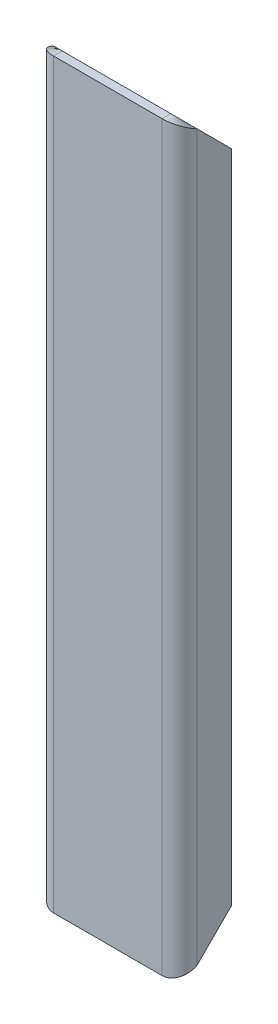
ISO-10303-21;
HEADER;
FILE_DESCRIPTION(('STEP AP214'),'2;1');
FILE_NAME('part.step','',(''),(''),'','','');
FILE_SCHEMA(('AUTOMOTIVE_DESIGN { 1 0 10303 214 1 1 1 1 }'));
ENDSEC;
DATA;
#1=APPLICATION_CONTEXT('core data for automotive mechanical design processes');
#2=APPLICATION_PROTOCOL_DEFINITION('international standard','automotive_design',2000,#1);
#3=PRODUCT_CONTEXT('',#1,'mechanical');
#4=PRODUCT('Part','Part','',(#3));
#5=PRODUCT_RELATED_PRODUCT_CATEGORY('part','',(#4));
#6=PRODUCT_DEFINITION_FORMATION('','',#4);
#7=PRODUCT_DEFINITION_CONTEXT('part definition',#1,'design');
#8=PRODUCT_DEFINITION('design','',#6,#7);
#9=PRODUCT_DEFINITION_SHAPE('','',#8);
#10=(LENGTH_UNIT() NAMED_UNIT(*) SI_UNIT(.MILLI.,.METRE.));
#11=(NAMED_UNIT(*) PLANE_ANGLE_UNIT() SI_UNIT($,.RADIAN.));
#12=(NAMED_UNIT(*) SI_UNIT($,.STERADIAN.) SOLID_ANGLE_UNIT());
#13=UNCERTAINTY_MEASURE_WITH_UNIT(LENGTH_MEASURE(1.E-05),#10,'distance_accuracy_value','');
#14=(GEOMETRIC_REPRESENTATION_CONTEXT(3) GLOBAL_UNCERTAINTY_ASSIGNED_CONTEXT((#13)) GLOBAL_UNIT_ASSIGNED_CONTEXT((#10,
#11,#12)) REPRESENTATION_CONTEXT('',''));
#15=CARTESIAN_POINT('',(0.,0.,0.));
#16=DIRECTION('',(0.,0.,1.));
#17=DIRECTION('',(1.,0.,0.));
#18=AXIS2_PLACEMENT_3D('',#15,#16,#17);
#19=CARTESIAN_POINT('',(16.5,175.,0.));
#20=DIRECTION('',(-1.,0.,0.));
#21=DIRECTION('',(0.,0.,1.));
#22=AXIS2_PLACEMENT_3D('',#19,#20,#21);
#23=PLANE('',#22);
#24=DIRECTION('',(0.,-0.707106781186544,-0.707106781186552));
#25=VECTOR('',#24,1.);
#26=CARTESIAN_POINT('',(16.5,175.,1.99999999999999));
#27=LINE('',#26,#25);
#28=CARTESIAN_POINT('',(16.5,171.,-2.00000000000001));
#29=VERTEX_POINT('',#28);
#30=CARTESIAN_POINT('',(16.5,163.,-10.));
#31=VERTEX_POINT('',#30);
#32=EDGE_CURVE('E245',#29,#31,#27,.T.);
#33=ORIENTED_EDGE('',*,*,#32,.F.);
#34=DIRECTION('',(0.,-1.,0.));
#35=VECTOR('',#34,1.);
#36=CARTESIAN_POINT('',(16.5,175.,-2.00000000000001));
#37=LINE('',#36,#35);
#38=CARTESIAN_POINT('',(16.5,3.99999999999998,-2.00000000000001));
#39=VERTEX_POINT('',#38);
#40=EDGE_CURVE('E60',#29,#39,#37,.T.);
#41=ORIENTED_EDGE('',*,*,#40,.T.);
#42=DIRECTION('',(0.,0.707106781186543,-0.707106781186552));
#43=VECTOR('',#42,1.);
#44=CARTESIAN_POINT('',(16.5,88.499999999999,-86.5));
#45=LINE('',#44,#43);
#46=CARTESIAN_POINT('',(16.5,11.9999999999999,-10.));
#47=VERTEX_POINT('',#46);
#48=EDGE_CURVE('E197',#39,#47,#45,.T.);
#49=ORIENTED_EDGE('',*,*,#48,.T.);
#50=DIRECTION('',(0.,-1.,0.));
#51=VECTOR('',#50,1.);
#52=CARTESIAN_POINT('',(16.5,175.,-10.));
#53=LINE('',#52,#51);
#54=EDGE_CURVE('E11',#31,#47,#53,.T.);
#55=ORIENTED_EDGE('',*,*,#54,.F.);
#56=EDGE_LOOP('',(#33,#41,#49,#55));
#57=FACE_BOUND('',#56,.T.);
#58=ADVANCED_FACE('F38',(#57),#23,.F.);
#59=CARTESIAN_POINT('',(14.5,175.,-10.));
#60=DIRECTION('',(0.,0.,-1.));
#61=DIRECTION('',(-1.,0.,0.));
#62=AXIS2_PLACEMENT_3D('',#59,#60,#61);
#63=PLANE('',#62);
#64=DIRECTION('',(0.,-1.,0.));
#65=VECTOR('',#64,1.);
#66=CARTESIAN_POINT('',(14.5,175.,-10.));
#67=LINE('',#66,#65);
#68=CARTESIAN_POINT('',(14.5,163.,-10.));
#69=VERTEX_POINT('',#68);
#70=CARTESIAN_POINT('',(14.5,11.9999999999999,-10.));
#71=VERTEX_POINT('',#70);
#72=EDGE_CURVE('E45',#69,#71,#67,.T.);
#73=ORIENTED_EDGE('',*,*,#72,.F.);
#74=DIRECTION('',(1.,0.,0.));
#75=VECTOR('',#74,1.);
#76=CARTESIAN_POINT('',(16.5,163.,-10.));
#77=LINE('',#76,#75);
#78=EDGE_CURVE('E248',#31,#69,#77,.F.);
#79=ORIENTED_EDGE('',*,*,#78,.F.);
#80=ORIENTED_EDGE('',*,*,#54,.T.);
#81=DIRECTION('',(-1.,0.,0.));
#82=VECTOR('',#81,1.);
#83=CARTESIAN_POINT('',(14.5,11.9999999999999,-10.));
#84=LINE('',#83,#82);
#85=EDGE_CURVE('E195',#71,#47,#84,.F.);
#86=ORIENTED_EDGE('',*,*,#85,.F.);
#87=EDGE_LOOP('',(#73,#79,#80,#86));
#88=FACE_BOUND('',#87,.T.);
#89=ADVANCED_FACE('F200',(#88),#63,.T.);
#90=CARTESIAN_POINT('',(14.5,175.,0.));
#91=DIRECTION('',(-1.,0.,0.));
#92=DIRECTION('',(0.,0.,1.));
#93=AXIS2_PLACEMENT_3D('',#90,#91,#92);
#94=PLANE('',#93);
#95=DIRECTION('',(0.,-1.,0.));
#96=VECTOR('',#95,1.);
#97=CARTESIAN_POINT('',(14.5,175.,-2.00000000000001));
#98=LINE('',#97,#96);
#99=CARTESIAN_POINT('',(14.5,171.,-2.00000000000001));
#100=VERTEX_POINT('',#99);
#101=CARTESIAN_POINT('',(14.5,3.99999999999998,-2.00000000000001));
#102=VERTEX_POINT('',#101);
#103=EDGE_CURVE('E177',#100,#102,#98,.T.);
#104=ORIENTED_EDGE('',*,*,#103,.F.);
#105=DIRECTION('',(0.,-0.707106781186544,-0.707106781186552));
#106=VECTOR('',#105,1.);
#107=CARTESIAN_POINT('',(14.5,175.,1.99999999999999));
#108=LINE('',#107,#106);
#109=EDGE_CURVE('E186',#100,#69,#108,.T.);
#110=ORIENTED_EDGE('',*,*,#109,.T.);
#111=ORIENTED_EDGE('',*,*,#72,.T.);
#112=DIRECTION('',(0.,0.707106781186543,-0.707106781186552));
#113=VECTOR('',#112,1.);
#114=CARTESIAN_POINT('',(14.5,88.499999999999,-86.5));
#115=LINE('',#114,#113);
#116=EDGE_CURVE('E185',#102,#71,#115,.T.);
#117=ORIENTED_EDGE('',*,*,#116,.F.);
#118=EDGE_LOOP('',(#104,#110,#111,#117));
#119=FACE_BOUND('',#118,.T.);
#120=ADVANCED_FACE('F184',(#119),#94,.T.);
#121=CARTESIAN_POINT('',(12.5,175.,-2.00000000000001));
#122=DIRECTION('',(0.,-1.,0.));
#123=DIRECTION('',(0.,0.,-1.));
#124=AXIS2_PLACEMENT_3D('',#121,#122,#123);
#125=CYLINDRICAL_SURFACE('',#124,2.);
#126=DIRECTION('',(0.,-1.,0.));
#127=VECTOR('',#126,1.);
#128=CARTESIAN_POINT('',(12.5,175.,0.));
#129=LINE('',#128,#127);
#130=CARTESIAN_POINT('',(12.5,173.,0.));
#131=VERTEX_POINT('',#130);
#132=CARTESIAN_POINT('',(12.5,1.99999999999998,0.));
#133=VERTEX_POINT('',#132);
#134=EDGE_CURVE('E175',#131,#133,#129,.T.);
#135=ORIENTED_EDGE('',*,*,#134,.F.);
#136=CARTESIAN_POINT('',(12.5,171.,-2.00000000000001));
#137=DIRECTION('',(0.,-0.707106781186552,0.707106781186543));
#138=DIRECTION('',(0.,-0.707106781186543,-0.707106781186552));
#139=AXIS2_PLACEMENT_3D('',#136,#137,#138);
#140=ELLIPSE('',#139,2.82842712474617,2.);
#141=EDGE_CURVE('E156',#100,#131,#140,.T.);
#142=ORIENTED_EDGE('',*,*,#141,.F.);
#143=ORIENTED_EDGE('',*,*,#103,.T.);
#144=CARTESIAN_POINT('',(12.5,3.99999999999998,-2.00000000000001));
#145=DIRECTION('',(0.,0.707106781186552,0.707106781186543));
#146=DIRECTION('',(0.,-0.707106781186543,0.707106781186552));
#147=AXIS2_PLACEMENT_3D('',#144,#145,#146);
#148=ELLIPSE('',#147,2.82842712474617,2.);
#149=EDGE_CURVE('E224',#133,#102,#148,.T.);
#150=ORIENTED_EDGE('',*,*,#149,.F.);
#151=EDGE_LOOP('',(#135,#142,#143,#150));
#152=FACE_BOUND('',#151,.T.);
#153=ADVANCED_FACE('F291',(#152),#125,.F.);
#154=CARTESIAN_POINT('',(-14.5,175.,0.));
#155=DIRECTION('',(0.,0.,-1.));
#156=DIRECTION('',(-1.,0.,0.));
#157=AXIS2_PLACEMENT_3D('',#154,#155,#156);
#158=PLANE('',#157);
#159=DIRECTION('',(0.,-1.,0.));
#160=VECTOR('',#159,1.);
#161=CARTESIAN_POINT('',(-12.5,175.,0.));
#162=LINE('',#161,#160);
#163=CARTESIAN_POINT('',(-12.5,173.,0.));
#164=VERTEX_POINT('',#163);
#165=CARTESIAN_POINT('',(-12.5,1.99999999999997,0.));
#166=VERTEX_POINT('',#165);
#167=EDGE_CURVE('E173',#164,#166,#162,.T.);
#168=ORIENTED_EDGE('',*,*,#167,.F.);
#169=DIRECTION('',(-1.,0.,0.));
#170=VECTOR('',#169,1.);
#171=CARTESIAN_POINT('',(-14.5,173.,0.));
#172=LINE('',#171,#170);
#173=EDGE_CURVE('E288',#131,#164,#172,.T.);
#174=ORIENTED_EDGE('',*,*,#173,.F.);
#175=ORIENTED_EDGE('',*,*,#134,.T.);
#176=DIRECTION('',(1.,0.,0.));
#177=VECTOR('',#176,1.);
#178=CARTESIAN_POINT('',(-14.5,1.99999999999997,0.));
#179=LINE('',#178,#177);
#180=EDGE_CURVE('E234',#166,#133,#179,.T.);
#181=ORIENTED_EDGE('',*,*,#180,.F.);
#182=EDGE_LOOP('',(#168,#174,#175,#181));
#183=FACE_BOUND('',#182,.T.);
#184=ADVANCED_FACE('F284',(#183),#158,.T.);
#185=CARTESIAN_POINT('',(-12.5,175.,-2.));
#186=DIRECTION('',(0.,-1.,0.));
#187=DIRECTION('',(0.,0.,-1.));
#188=AXIS2_PLACEMENT_3D('',#185,#186,#187);
#189=CYLINDRICAL_SURFACE('',#188,2.);
#190=DIRECTION('',(0.,-1.,0.));
#191=VECTOR('',#190,1.);
#192=CARTESIAN_POINT('',(-14.5,175.,-2.));
#193=LINE('',#192,#191);
#194=CARTESIAN_POINT('',(-14.5,171.,-2.));
#195=VERTEX_POINT('',#194);
#196=CARTESIAN_POINT('',(-14.5,3.99999999999996,-2.));
#197=VERTEX_POINT('',#196);
#198=EDGE_CURVE('E171',#195,#197,#193,.T.);
#199=ORIENTED_EDGE('',*,*,#198,.F.);
#200=CARTESIAN_POINT('',(-12.5,171.,-2.));
#201=DIRECTION('',(0.,-0.707106781186552,0.707106781186543));
#202=DIRECTION('',(0.,-0.707106781186543,-0.707106781186552));
#203=AXIS2_PLACEMENT_3D('',#200,#201,#202);
#204=ELLIPSE('',#203,2.82842712474617,2.);
#205=EDGE_CURVE('E134',#164,#195,#204,.T.);
#206=ORIENTED_EDGE('',*,*,#205,.F.);
#207=ORIENTED_EDGE('',*,*,#167,.T.);
#208=CARTESIAN_POINT('',(-12.5,3.99999999999995,-2.));
#209=DIRECTION('',(0.,0.707106781186552,0.707106781186543));
#210=DIRECTION('',(0.,-0.707106781186543,0.707106781186552));
#211=AXIS2_PLACEMENT_3D('',#208,#209,#210);
#212=ELLIPSE('',#211,2.82842712474617,2.);
#213=EDGE_CURVE('E223',#197,#166,#212,.T.);
#214=ORIENTED_EDGE('',*,*,#213,.F.);
#215=EDGE_LOOP('',(#199,#206,#207,#214));
#216=FACE_BOUND('',#215,.T.);
#217=ADVANCED_FACE('F279',(#216),#189,.F.);
#218=CARTESIAN_POINT('',(-14.5,175.,0.));
#219=DIRECTION('',(1.,0.,0.));
#220=DIRECTION('',(0.,0.,-1.));
#221=AXIS2_PLACEMENT_3D('',#218,#219,#220);
#222=PLANE('',#221);
#223=DIRECTION('',(0.,-1.,0.));
#224=VECTOR('',#223,1.);
#225=CARTESIAN_POINT('',(-14.5,175.,-20.));
#226=LINE('',#225,#224);
#227=CARTESIAN_POINT('',(-14.5,153.,-20.));
#228=VERTEX_POINT('',#227);
#229=CARTESIAN_POINT('',(-14.5,21.9999999999997,-20.));
#230=VERTEX_POINT('',#229);
#231=EDGE_CURVE('E164',#228,#230,#226,.T.);
#232=ORIENTED_EDGE('',*,*,#231,.F.);
#233=DIRECTION('',(0.,-0.707106781186544,-0.707106781186552));
#234=VECTOR('',#233,1.);
#235=CARTESIAN_POINT('',(-14.5,175.,1.99999999999999));
#236=LINE('',#235,#234);
#237=EDGE_CURVE('E138',#195,#228,#236,.T.);
#238=ORIENTED_EDGE('',*,*,#237,.F.);
#239=ORIENTED_EDGE('',*,*,#198,.T.);
#240=DIRECTION('',(0.,-0.707106781186543,0.707106781186552));
#241=VECTOR('',#240,1.);
#242=CARTESIAN_POINT('',(-14.5,88.499999999999,-86.5));
#243=LINE('',#242,#241);
#244=EDGE_CURVE('E259',#230,#197,#243,.T.);
#245=ORIENTED_EDGE('',*,*,#244,.F.);
#246=EDGE_LOOP('',(#232,#238,#239,#245));
#247=FACE_BOUND('',#246,.T.);
#248=ADVANCED_FACE('F275',(#247),#222,.T.);
#249=CARTESIAN_POINT('',(-16.5,175.,-20.));
#250=DIRECTION('',(0.,0.,-1.));
#251=DIRECTION('',(-1.,0.,0.));
#252=AXIS2_PLACEMENT_3D('',#249,#250,#251);
#253=PLANE('',#252);
#254=DIRECTION('',(0.,-1.,0.));
#255=VECTOR('',#254,1.);
#256=CARTESIAN_POINT('',(-16.5,175.,-20.));
#257=LINE('',#256,#255);
#258=CARTESIAN_POINT('',(-16.5,153.,-20.));
#259=VERTEX_POINT('',#258);
#260=CARTESIAN_POINT('',(-16.5,21.9999999999997,-20.));
#261=VERTEX_POINT('',#260);
#262=EDGE_CURVE('E162',#259,#261,#257,.T.);
#263=ORIENTED_EDGE('',*,*,#262,.F.);
#264=DIRECTION('',(-1.,0.,0.));
#265=VECTOR('',#264,1.);
#266=CARTESIAN_POINT('',(-16.5,153.,-20.));
#267=LINE('',#266,#265);
#268=EDGE_CURVE('E137',#259,#228,#267,.F.);
#269=ORIENTED_EDGE('',*,*,#268,.T.);
#270=ORIENTED_EDGE('',*,*,#231,.T.);
#271=DIRECTION('',(1.,0.,0.));
#272=VECTOR('',#271,1.);
#273=CARTESIAN_POINT('',(-14.5,21.9999999999997,-20.));
#274=LINE('',#273,#272);
#275=EDGE_CURVE('E243',#230,#261,#274,.F.);
#276=ORIENTED_EDGE('',*,*,#275,.T.);
#277=EDGE_LOOP('',(#263,#269,#270,#276));
#278=FACE_BOUND('',#277,.T.);
#279=ADVANCED_FACE('F270',(#278),#253,.T.);
#280=CARTESIAN_POINT('',(-16.5,175.,0.));
#281=DIRECTION('',(1.,0.,0.));
#282=DIRECTION('',(0.,0.,-1.));
#283=AXIS2_PLACEMENT_3D('',#280,#281,#282);
#284=PLANE('',#283);
#285=DIRECTION('',(0.,-0.707106781186544,-0.707106781186552));
#286=VECTOR('',#285,1.);
#287=CARTESIAN_POINT('',(-16.5,175.,1.99999999999999));
#288=LINE('',#287,#286);
#289=CARTESIAN_POINT('',(-16.5,171.,-2.));
#290=VERTEX_POINT('',#289);
#291=EDGE_CURVE('E141',#290,#259,#288,.T.);
#292=ORIENTED_EDGE('',*,*,#291,.T.);
#293=ORIENTED_EDGE('',*,*,#262,.T.);
#294=DIRECTION('',(0.,-0.707106781186543,0.707106781186552));
#295=VECTOR('',#294,1.);
#296=CARTESIAN_POINT('',(-16.5,88.499999999999,-86.5));
#297=LINE('',#296,#295);
#298=CARTESIAN_POINT('',(-16.5,3.99999999999995,-2.));
#299=VERTEX_POINT('',#298);
#300=EDGE_CURVE('E161',#261,#299,#297,.T.);
#301=ORIENTED_EDGE('',*,*,#300,.T.);
#302=DIRECTION('',(0.,-1.,0.));
#303=VECTOR('',#302,1.);
#304=CARTESIAN_POINT('',(-16.5,175.,-2.));
#305=LINE('',#304,#303);
#306=EDGE_CURVE('E153',#290,#299,#305,.T.);
#307=ORIENTED_EDGE('',*,*,#306,.F.);
#308=EDGE_LOOP('',(#292,#293,#301,#307));
#309=FACE_BOUND('',#308,.T.);
#310=ADVANCED_FACE('F159',(#309),#284,.F.);
#311=CARTESIAN_POINT('',(-12.5,175.,-2.));
#312=DIRECTION('',(0.,-1.,0.));
#313=DIRECTION('',(0.,0.,-1.));
#314=AXIS2_PLACEMENT_3D('',#311,#312,#313);
#315=CYLINDRICAL_SURFACE('',#314,4.);
#316=CARTESIAN_POINT('',(-12.5,171.,-2.));
#317=DIRECTION('',(0.,-0.894427190999918,0.447213595499953));
#318=DIRECTION('',(0.,-0.447213595499953,-0.894427190999918));
#319=AXIS2_PLACEMENT_3D('',#316,#317,#318);
#320=ELLIPSE('',#319,4.47213595499957,4.);
#321=CARTESIAN_POINT('',(-12.5,173.,2.));
#322=VERTEX_POINT('',#321);
#323=EDGE_CURVE('E131',#322,#290,#320,.T.);
#324=ORIENTED_EDGE('',*,*,#323,.T.);
#325=ORIENTED_EDGE('',*,*,#306,.T.);
#326=CARTESIAN_POINT('',(-12.5,3.99999999999995,-2.));
#327=DIRECTION('',(0.,0.894427190999918,0.447213595499954));
#328=DIRECTION('',(0.,-0.447213595499954,0.894427190999918));
#329=AXIS2_PLACEMENT_3D('',#326,#327,#328);
#330=ELLIPSE('',#329,4.47213595499957,4.);
#331=CARTESIAN_POINT('',(-12.5,1.99999999999997,2.));
#332=VERTEX_POINT('',#331);
#333=EDGE_CURVE('E257',#299,#332,#330,.T.);
#334=ORIENTED_EDGE('',*,*,#333,.T.);
#335=DIRECTION('',(0.,-1.,0.));
#336=VECTOR('',#335,1.);
#337=CARTESIAN_POINT('',(-12.5,175.,2.));
#338=LINE('',#337,#336);
#339=EDGE_CURVE('E155',#322,#332,#338,.T.);
#340=ORIENTED_EDGE('',*,*,#339,.F.);
#341=EDGE_LOOP('',(#324,#325,#334,#340));
#342=FACE_BOUND('',#341,.T.);
#343=ADVANCED_FACE('F151',(#342),#315,.T.);
#344=CARTESIAN_POINT('',(-14.5,175.,2.));
#345=DIRECTION('',(0.,0.,-1.));
#346=DIRECTION('',(-1.,0.,0.));
#347=AXIS2_PLACEMENT_3D('',#344,#345,#346);
#348=PLANE('',#347);
#349=DIRECTION('',(-1.,0.,0.));
#350=VECTOR('',#349,1.);
#351=CARTESIAN_POINT('',(-14.5,173.,2.));
#352=LINE('',#351,#350);
#353=CARTESIAN_POINT('',(12.5,173.,1.99999999999999));
#354=VERTEX_POINT('',#353);
#355=EDGE_CURVE('E296',#354,#322,#352,.T.);
#356=ORIENTED_EDGE('',*,*,#355,.T.);
#357=ORIENTED_EDGE('',*,*,#339,.T.);
#358=DIRECTION('',(-1.,0.,0.));
#359=VECTOR('',#358,1.);
#360=CARTESIAN_POINT('',(-14.5,1.99999999999997,2.));
#361=LINE('',#360,#359);
#362=CARTESIAN_POINT('',(12.5,1.99999999999997,1.99999999999999));
#363=VERTEX_POINT('',#362);
#364=EDGE_CURVE('E231',#332,#363,#361,.F.);
#365=ORIENTED_EDGE('',*,*,#364,.T.);
#366=DIRECTION('',(0.,-1.,0.));
#367=VECTOR('',#366,1.);
#368=CARTESIAN_POINT('',(12.5,175.,1.99999999999999));
#369=LINE('',#368,#367);
#370=EDGE_CURVE('E166',#354,#363,#369,.T.);
#371=ORIENTED_EDGE('',*,*,#370,.F.);
#372=EDGE_LOOP('',(#356,#357,#365,#371));
#373=FACE_BOUND('',#372,.T.);
#374=ADVANCED_FACE('F237',(#373),#348,.F.);
#375=CARTESIAN_POINT('',(12.5,175.,-2.00000000000001));
#376=DIRECTION('',(0.,-1.,0.));
#377=DIRECTION('',(0.,0.,-1.));
#378=AXIS2_PLACEMENT_3D('',#375,#376,#377);
#379=CYLINDRICAL_SURFACE('',#378,4.);
#380=CARTESIAN_POINT('',(12.5,171.,-2.00000000000001));
#381=DIRECTION('',(0.,-0.894427190999918,0.447213595499953));
#382=DIRECTION('',(0.,-0.447213595499953,-0.894427190999918));
#383=AXIS2_PLACEMENT_3D('',#380,#381,#382);
#384=ELLIPSE('',#383,4.47213595499957,4.);
#385=EDGE_CURVE('E213',#29,#354,#384,.T.);
#386=ORIENTED_EDGE('',*,*,#385,.T.);
#387=ORIENTED_EDGE('',*,*,#370,.T.);
#388=CARTESIAN_POINT('',(12.5,3.99999999999998,-2.00000000000001));
#389=DIRECTION('',(0.,0.894427190999918,0.447213595499954));
#390=DIRECTION('',(0.,-0.447213595499954,0.894427190999918));
#391=AXIS2_PLACEMENT_3D('',#388,#389,#390);
#392=ELLIPSE('',#391,4.47213595499957,4.);
#393=EDGE_CURVE('E212',#363,#39,#392,.T.);
#394=ORIENTED_EDGE('',*,*,#393,.T.);
#395=ORIENTED_EDGE('',*,*,#40,.F.);
#396=EDGE_LOOP('',(#386,#387,#394,#395));
#397=FACE_BOUND('',#396,.T.);
#398=ADVANCED_FACE('F211',(#397),#379,.T.);
#399=CARTESIAN_POINT('',(14.5,88.499999999999,-86.5));
#400=DIRECTION('',(0.,0.707106781186552,0.707106781186543));
#401=DIRECTION('',(0.,0.707106781186543,-0.707106781186552));
#402=AXIS2_PLACEMENT_3D('',#399,#400,#401);
#403=PLANE('',#402);
#404=ORIENTED_EDGE('',*,*,#116,.T.);
#405=ORIENTED_EDGE('',*,*,#85,.T.);
#406=ORIENTED_EDGE('',*,*,#48,.F.);
#407=DIRECTION('',(-1.,0.,0.));
#408=VECTOR('',#407,1.);
#409=CARTESIAN_POINT('',(14.5,3.99999999999998,-2.00000000000001));
#410=LINE('',#409,#408);
#411=EDGE_CURVE('E196',#102,#39,#410,.F.);
#412=ORIENTED_EDGE('',*,*,#411,.F.);
#413=EDGE_LOOP('',(#404,#405,#406,#412));
#414=FACE_BOUND('',#413,.T.);
#415=ADVANCED_FACE('F193',(#414),#403,.F.);
#416=CARTESIAN_POINT('',(-14.5,1.99999999999997,0.));
#417=DIRECTION('',(0.,1.,0.));
#418=DIRECTION('',(1.,0.,0.));
#419=AXIS2_PLACEMENT_3D('',#416,#417,#418);
#420=PLANE('',#419);
#421=ORIENTED_EDGE('',*,*,#180,.T.);
#422=DIRECTION('',(0.,0.,-1.));
#423=VECTOR('',#422,1.);
#424=CARTESIAN_POINT('',(12.5,1.99999999999998,0.));
#425=LINE('',#424,#423);
#426=EDGE_CURVE('E198',#133,#363,#425,.F.);
#427=ORIENTED_EDGE('',*,*,#426,.T.);
#428=ORIENTED_EDGE('',*,*,#364,.F.);
#429=DIRECTION('',(0.,0.,-1.));
#430=VECTOR('',#429,1.);
#431=CARTESIAN_POINT('',(-12.5,1.99999999999997,0.));
#432=LINE('',#431,#430);
#433=EDGE_CURVE('E235',#166,#332,#432,.F.);
#434=ORIENTED_EDGE('',*,*,#433,.F.);
#435=EDGE_LOOP('',(#421,#427,#428,#434));
#436=FACE_BOUND('',#435,.T.);
#437=ADVANCED_FACE('F229',(#436),#420,.F.);
#438=CARTESIAN_POINT('',(-14.5,88.499999999999,-86.5));
#439=DIRECTION('',(0.,0.707106781186552,0.707106781186543));
#440=DIRECTION('',(0.,-0.707106781186543,0.707106781186552));
#441=AXIS2_PLACEMENT_3D('',#438,#439,#440);
#442=PLANE('',#441);
#443=ORIENTED_EDGE('',*,*,#244,.T.);
#444=DIRECTION('',(1.,0.,0.));
#445=VECTOR('',#444,1.);
#446=CARTESIAN_POINT('',(-14.5,3.99999999999996,-2.));
#447=LINE('',#446,#445);
#448=EDGE_CURVE('E240',#197,#299,#447,.F.);
#449=ORIENTED_EDGE('',*,*,#448,.T.);
#450=ORIENTED_EDGE('',*,*,#300,.F.);
#451=ORIENTED_EDGE('',*,*,#275,.F.);
#452=EDGE_LOOP('',(#443,#449,#450,#451));
#453=FACE_BOUND('',#452,.T.);
#454=ADVANCED_FACE('F273',(#453),#442,.F.);
#455=CARTESIAN_POINT('',(-12.5,1.99999999999997,0.));
#456=CARTESIAN_POINT('',(-12.5,1.99999999999997,0.666666666666666));
#457=CARTESIAN_POINT('',(-12.5,1.99999999999997,1.33333333333333));
#458=CARTESIAN_POINT('',(-12.5,1.99999999999997,2.));
#459=CARTESIAN_POINT('',(-8.5,1.99999999999997,0.));
#460=CARTESIAN_POINT('',(-7.16666666666667,1.99999999999997,0.666666666666667));
#461=CARTESIAN_POINT('',(-5.83333333333334,1.99999999999997,1.33333333333333));
#462=CARTESIAN_POINT('',(-4.5,1.99999999999997,2.));
#463=CARTESIAN_POINT('',(-8.5,5.99999999999993,-4.));
#464=CARTESIAN_POINT('',(-7.16666666666667,5.99999999999993,-4.66666666666667));
#465=CARTESIAN_POINT('',(-5.83333333333334,5.99999999999993,-5.33333333333333));
#466=CARTESIAN_POINT('',(-4.5,5.99999999999993,-6.));
#467=CARTESIAN_POINT('',(-12.5,5.99999999999993,-4.));
#468=CARTESIAN_POINT('',(-12.5,5.99999999999993,-4.66666666666667));
#469=CARTESIAN_POINT('',(-12.5,5.99999999999993,-5.33333333333333));
#470=CARTESIAN_POINT('',(-12.5,5.99999999999993,-6.));
#471=CARTESIAN_POINT('',(-16.5,5.99999999999993,-4.));
#472=CARTESIAN_POINT('',(-17.8333333333333,5.99999999999993,-4.66666666666667));
#473=CARTESIAN_POINT('',(-19.1666666666667,5.99999999999993,-5.33333333333334));
#474=CARTESIAN_POINT('',(-20.5,5.99999999999993,-6.));
#475=CARTESIAN_POINT('',(-16.5,1.99999999999997,0.));
#476=CARTESIAN_POINT('',(-17.8333333333333,1.99999999999997,0.666666666666667));
#477=CARTESIAN_POINT('',(-19.1666666666667,1.99999999999997,1.33333333333333));
#478=CARTESIAN_POINT('',(-20.5,1.99999999999997,2.));
#479=CARTESIAN_POINT('',(-12.5,1.99999999999997,0.));
#480=CARTESIAN_POINT('',(-12.5,1.99999999999997,0.666666666666666));
#481=CARTESIAN_POINT('',(-12.5,1.99999999999997,1.33333333333333));
#482=CARTESIAN_POINT('',(-12.5,1.99999999999997,2.));
#483=(BOUNDED_SURFACE() B_SPLINE_SURFACE(3,3,((#455,#456,#457,#458),(#459,#460,#461,#462),(#463,
#464,#465,#466),(#467,#468,#469,#470),(#471,#472,#473,#474),(#475,#476,#477,#478),(#479,#480,
#481,#482)),.UNSPECIFIED.,.T.,.F.,.F.) B_SPLINE_SURFACE_WITH_KNOTS((4,3,4),(4,4),(0.,0.5,1.),
(0.,1.),.UNSPECIFIED.) GEOMETRIC_REPRESENTATION_ITEM() RATIONAL_B_SPLINE_SURFACE(((1.,1.,1.,1.),
(0.333333333333333,0.333333333333333,0.333333333333333,0.333333333333333),(0.333333333333333,
0.333333333333333,0.333333333333333,0.333333333333333),(1.,1.,1.,1.),(0.333333333333333,
0.333333333333333,0.333333333333333,0.333333333333333),(0.333333333333333,0.333333333333333,
0.333333333333333,0.333333333333333),(1.,1.,1.,1.))) REPRESENTATION_ITEM('') SURFACE());
#484=ORIENTED_EDGE('',*,*,#213,.T.);
#485=ORIENTED_EDGE('',*,*,#433,.T.);
#486=ORIENTED_EDGE('',*,*,#333,.F.);
#487=ORIENTED_EDGE('',*,*,#448,.F.);
#488=EDGE_LOOP('',(#484,#485,#486,#487));
#489=FACE_BOUND('',#488,.T.);
#490=ADVANCED_FACE('F282',(#489),#483,.T.);
#491=CARTESIAN_POINT('',(12.5,2.,0.));
#492=CARTESIAN_POINT('',(12.5,2.,0.666666666666661));
#493=CARTESIAN_POINT('',(12.5,2.,1.33333333333333));
#494=CARTESIAN_POINT('',(12.5,2.,1.99999999999999));
#495=CARTESIAN_POINT('',(16.5,2.,0.));
#496=CARTESIAN_POINT('',(17.8333333333333,2.,0.666666666666662));
#497=CARTESIAN_POINT('',(19.1666666666667,2.,1.33333333333333));
#498=CARTESIAN_POINT('',(20.5,2.,1.99999999999999));
#499=CARTESIAN_POINT('',(16.5,5.99999999999995,-4.));
#500=CARTESIAN_POINT('',(17.8333333333333,5.99999999999995,-4.66666666666667));
#501=CARTESIAN_POINT('',(19.1666666666667,5.99999999999996,-5.33333333333334));
#502=CARTESIAN_POINT('',(20.5,5.99999999999996,-6.));
#503=CARTESIAN_POINT('',(12.5,5.99999999999995,-4.00000000000001));
#504=CARTESIAN_POINT('',(12.5,5.99999999999995,-4.66666666666667));
#505=CARTESIAN_POINT('',(12.5,5.99999999999996,-5.33333333333334));
#506=CARTESIAN_POINT('',(12.5,5.99999999999996,-6.00000000000001));
#507=CARTESIAN_POINT('',(8.5,5.99999999999995,-4.00000000000001));
#508=CARTESIAN_POINT('',(7.16666666666667,5.99999999999996,-4.66666666666667));
#509=CARTESIAN_POINT('',(5.83333333333333,5.99999999999996,-5.33333333333334));
#510=CARTESIAN_POINT('',(4.5,5.99999999999996,-6.00000000000001));
#511=CARTESIAN_POINT('',(8.5,2.,0.));
#512=CARTESIAN_POINT('',(7.16666666666667,2.,0.666666666666662));
#513=CARTESIAN_POINT('',(5.83333333333333,2.,1.33333333333333));
#514=CARTESIAN_POINT('',(4.5,2.,1.99999999999999));
#515=CARTESIAN_POINT('',(12.5,2.,0.));
#516=CARTESIAN_POINT('',(12.5,2.,0.666666666666661));
#517=CARTESIAN_POINT('',(12.5,2.,1.33333333333333));
#518=CARTESIAN_POINT('',(12.5,2.,1.99999999999999));
#519=(BOUNDED_SURFACE() B_SPLINE_SURFACE(3,3,((#491,#492,#493,#494),(#495,#496,#497,#498),(#499,
#500,#501,#502),(#503,#504,#505,#506),(#507,#508,#509,#510),(#511,#512,#513,#514),(#515,#516,
#517,#518)),.UNSPECIFIED.,.T.,.F.,.F.) B_SPLINE_SURFACE_WITH_KNOTS((4,3,4),(4,4),(0.,0.5,1.),
(0.,1.),.UNSPECIFIED.) GEOMETRIC_REPRESENTATION_ITEM() RATIONAL_B_SPLINE_SURFACE(((1.,1.,1.,1.),
(0.333333333333333,0.333333333333333,0.333333333333333,0.333333333333333),(0.333333333333333,
0.333333333333333,0.333333333333333,0.333333333333333),(1.,1.,1.,1.),(0.333333333333333,
0.333333333333333,0.333333333333333,0.333333333333333),(0.333333333333333,0.333333333333333,
0.333333333333333,0.333333333333333),(1.,1.,1.,1.))) REPRESENTATION_ITEM('') SURFACE());
#520=ORIENTED_EDGE('',*,*,#149,.T.);
#521=ORIENTED_EDGE('',*,*,#411,.T.);
#522=ORIENTED_EDGE('',*,*,#393,.F.);
#523=ORIENTED_EDGE('',*,*,#426,.F.);
#524=EDGE_LOOP('',(#520,#521,#522,#523));
#525=FACE_BOUND('',#524,.T.);
#526=ADVANCED_FACE('F221',(#525),#519,.T.);
#527=CARTESIAN_POINT('',(16.5,175.,1.99999999999999));
#528=DIRECTION('',(0.,0.707106781186552,-0.707106781186544));
#529=DIRECTION('',(0.,-0.707106781186544,-0.707106781186552));
#530=AXIS2_PLACEMENT_3D('',#527,#528,#529);
#531=PLANE('',#530);
#532=DIRECTION('',(1.,0.,0.));
#533=VECTOR('',#532,1.);
#534=CARTESIAN_POINT('',(16.5,171.,-2.00000000000001));
#535=LINE('',#534,#533);
#536=EDGE_CURVE('E252',#29,#100,#535,.F.);
#537=ORIENTED_EDGE('',*,*,#536,.F.);
#538=ORIENTED_EDGE('',*,*,#32,.T.);
#539=ORIENTED_EDGE('',*,*,#78,.T.);
#540=ORIENTED_EDGE('',*,*,#109,.F.);
#541=EDGE_LOOP('',(#537,#538,#539,#540));
#542=FACE_BOUND('',#541,.T.);
#543=ADVANCED_FACE('F311',(#542),#531,.T.);
#544=CARTESIAN_POINT('',(-16.5,175.,1.99999999999999));
#545=DIRECTION('',(0.,-0.707106781186552,0.707106781186544));
#546=DIRECTION('',(0.,-0.707106781186544,-0.707106781186552));
#547=AXIS2_PLACEMENT_3D('',#544,#545,#546);
#548=PLANE('',#547);
#549=ORIENTED_EDGE('',*,*,#268,.F.);
#550=ORIENTED_EDGE('',*,*,#291,.F.);
#551=DIRECTION('',(-1.,0.,0.));
#552=VECTOR('',#551,1.);
#553=CARTESIAN_POINT('',(-16.5,171.,-2.));
#554=LINE('',#553,#552);
#555=EDGE_CURVE('E127',#290,#195,#554,.F.);
#556=ORIENTED_EDGE('',*,*,#555,.T.);
#557=ORIENTED_EDGE('',*,*,#237,.T.);
#558=EDGE_LOOP('',(#549,#550,#556,#557));
#559=FACE_BOUND('',#558,.T.);
#560=ADVANCED_FACE('F142',(#559),#548,.F.);
#561=CARTESIAN_POINT('',(-14.5,173.,0.));
#562=DIRECTION('',(0.,-1.,0.));
#563=DIRECTION('',(-1.,0.,0.));
#564=AXIS2_PLACEMENT_3D('',#561,#562,#563);
#565=PLANE('',#564);
#566=ORIENTED_EDGE('',*,*,#173,.T.);
#567=DIRECTION('',(0.,0.,-1.));
#568=VECTOR('',#567,1.);
#569=CARTESIAN_POINT('',(-12.5,173.,0.));
#570=LINE('',#569,#568);
#571=EDGE_CURVE('E147',#164,#322,#570,.F.);
#572=ORIENTED_EDGE('',*,*,#571,.T.);
#573=ORIENTED_EDGE('',*,*,#355,.F.);
#574=DIRECTION('',(0.,0.,-1.));
#575=VECTOR('',#574,1.);
#576=CARTESIAN_POINT('',(12.5,173.,0.));
#577=LINE('',#576,#575);
#578=EDGE_CURVE('E52',#131,#354,#577,.F.);
#579=ORIENTED_EDGE('',*,*,#578,.F.);
#580=EDGE_LOOP('',(#566,#572,#573,#579));
#581=FACE_BOUND('',#580,.T.);
#582=ADVANCED_FACE('F302',(#581),#565,.F.);
#583=CARTESIAN_POINT('',(12.5,169.,-4.00000000000001));
#584=CARTESIAN_POINT('',(12.5,169.,-4.66666666666667));
#585=CARTESIAN_POINT('',(12.5,169.,-5.33333333333334));
#586=CARTESIAN_POINT('',(12.5,169.,-6.00000000000001));
#587=CARTESIAN_POINT('',(16.5,169.,-4.00000000000001));
#588=CARTESIAN_POINT('',(17.8333333333333,169.,-4.66666666666667));
#589=CARTESIAN_POINT('',(19.1666666666667,169.,-5.33333333333334));
#590=CARTESIAN_POINT('',(20.5,169.,-6.00000000000001));
#591=CARTESIAN_POINT('',(16.5,173.,0.));
#592=CARTESIAN_POINT('',(17.8333333333333,173.,0.666666666666661));
#593=CARTESIAN_POINT('',(19.1666666666667,173.,1.33333333333333));
#594=CARTESIAN_POINT('',(20.5,173.,1.99999999999999));
#595=CARTESIAN_POINT('',(12.5,173.,0.));
#596=CARTESIAN_POINT('',(12.5,173.,0.666666666666661));
#597=CARTESIAN_POINT('',(12.5,173.,1.33333333333333));
#598=CARTESIAN_POINT('',(12.5,173.,1.99999999999999));
#599=CARTESIAN_POINT('',(8.5,173.,0.));
#600=CARTESIAN_POINT('',(7.16666666666667,173.,0.666666666666662));
#601=CARTESIAN_POINT('',(5.83333333333333,173.,1.33333333333333));
#602=CARTESIAN_POINT('',(4.5,173.,2.));
#603=CARTESIAN_POINT('',(8.5,169.,-4.00000000000001));
#604=CARTESIAN_POINT('',(7.16666666666667,169.,-4.66666666666667));
#605=CARTESIAN_POINT('',(5.83333333333333,169.,-5.33333333333334));
#606=CARTESIAN_POINT('',(4.5,169.,-6.00000000000001));
#607=CARTESIAN_POINT('',(12.5,169.,-4.00000000000001));
#608=CARTESIAN_POINT('',(12.5,169.,-4.66666666666667));
#609=CARTESIAN_POINT('',(12.5,169.,-5.33333333333334));
#610=CARTESIAN_POINT('',(12.5,169.,-6.00000000000001));
#611=(BOUNDED_SURFACE() B_SPLINE_SURFACE(3,3,((#583,#584,#585,#586),(#587,#588,#589,#590),(#591,
#592,#593,#594),(#595,#596,#597,#598),(#599,#600,#601,#602),(#603,#604,#605,#606),(#607,#608,
#609,#610)),.UNSPECIFIED.,.T.,.F.,.F.) B_SPLINE_SURFACE_WITH_KNOTS((4,3,4),(4,4),(0.,0.5,1.),
(0.,1.),.UNSPECIFIED.) GEOMETRIC_REPRESENTATION_ITEM() RATIONAL_B_SPLINE_SURFACE(((1.,1.,1.,1.),
(0.333333333333333,0.333333333333333,0.333333333333333,0.333333333333333),(0.333333333333333,
0.333333333333333,0.333333333333333,0.333333333333333),(1.,1.,1.,1.),(0.333333333333333,
0.333333333333333,0.333333333333333,0.333333333333333),(0.333333333333333,0.333333333333333,
0.333333333333333,0.333333333333333),(1.,1.,1.,1.))) REPRESENTATION_ITEM('') SURFACE());
#612=ORIENTED_EDGE('',*,*,#141,.T.);
#613=ORIENTED_EDGE('',*,*,#578,.T.);
#614=ORIENTED_EDGE('',*,*,#385,.F.);
#615=ORIENTED_EDGE('',*,*,#536,.T.);
#616=EDGE_LOOP('',(#612,#613,#614,#615));
#617=FACE_BOUND('',#616,.T.);
#618=ADVANCED_FACE('F304',(#617),#611,.T.);
#619=CARTESIAN_POINT('',(-12.5,169.,-4.));
#620=CARTESIAN_POINT('',(-12.5,169.,-4.66666666666667));
#621=CARTESIAN_POINT('',(-12.5,169.,-5.33333333333333));
#622=CARTESIAN_POINT('',(-12.5,169.,-6.));
#623=CARTESIAN_POINT('',(-8.5,169.,-4.));
#624=CARTESIAN_POINT('',(-7.16666666666667,169.,-4.66666666666667));
#625=CARTESIAN_POINT('',(-5.83333333333334,169.,-5.33333333333334));
#626=CARTESIAN_POINT('',(-4.5,169.,-6.));
#627=CARTESIAN_POINT('',(-8.5,173.,0.));
#628=CARTESIAN_POINT('',(-7.16666666666667,173.,0.666666666666666));
#629=CARTESIAN_POINT('',(-5.83333333333334,173.,1.33333333333333));
#630=CARTESIAN_POINT('',(-4.5,173.,2.));
#631=CARTESIAN_POINT('',(-12.5,173.,0.));
#632=CARTESIAN_POINT('',(-12.5,173.,0.666666666666666));
#633=CARTESIAN_POINT('',(-12.5,173.,1.33333333333333));
#634=CARTESIAN_POINT('',(-12.5,173.,2.));
#635=CARTESIAN_POINT('',(-16.5,173.,0.));
#636=CARTESIAN_POINT('',(-17.8333333333333,173.,0.666666666666667));
#637=CARTESIAN_POINT('',(-19.1666666666667,173.,1.33333333333333));
#638=CARTESIAN_POINT('',(-20.5,173.,2.));
#639=CARTESIAN_POINT('',(-16.5,169.,-4.));
#640=CARTESIAN_POINT('',(-17.8333333333333,169.,-4.66666666666667));
#641=CARTESIAN_POINT('',(-19.1666666666667,169.,-5.33333333333334));
#642=CARTESIAN_POINT('',(-20.5,169.,-6.));
#643=CARTESIAN_POINT('',(-12.5,169.,-4.));
#644=CARTESIAN_POINT('',(-12.5,169.,-4.66666666666667));
#645=CARTESIAN_POINT('',(-12.5,169.,-5.33333333333333));
#646=CARTESIAN_POINT('',(-12.5,169.,-6.));
#647=(BOUNDED_SURFACE() B_SPLINE_SURFACE(3,3,((#619,#620,#621,#622),(#623,#624,#625,#626),(#627,
#628,#629,#630),(#631,#632,#633,#634),(#635,#636,#637,#638),(#639,#640,#641,#642),(#643,#644,
#645,#646)),.UNSPECIFIED.,.T.,.F.,.F.) B_SPLINE_SURFACE_WITH_KNOTS((4,3,4),(4,4),(0.,0.5,1.),
(0.,1.),.UNSPECIFIED.) GEOMETRIC_REPRESENTATION_ITEM() RATIONAL_B_SPLINE_SURFACE(((1.,1.,1.,1.),
(0.333333333333333,0.333333333333333,0.333333333333333,0.333333333333333),(0.333333333333333,
0.333333333333333,0.333333333333333,0.333333333333333),(1.,1.,1.,1.),(0.333333333333333,
0.333333333333333,0.333333333333333,0.333333333333333),(0.333333333333333,0.333333333333333,
0.333333333333333,0.333333333333333),(1.,1.,1.,1.))) REPRESENTATION_ITEM('') SURFACE());
#648=ORIENTED_EDGE('',*,*,#205,.T.);
#649=ORIENTED_EDGE('',*,*,#555,.F.);
#650=ORIENTED_EDGE('',*,*,#323,.F.);
#651=ORIENTED_EDGE('',*,*,#571,.F.);
#652=EDGE_LOOP('',(#648,#649,#650,#651));
#653=FACE_BOUND('',#652,.T.);
#654=ADVANCED_FACE('F129',(#653),#647,.T.);
#655=CLOSED_SHELL('',(#58,#89,#120,#153,#184,#217,#248,#279,#310,#343,#374,#398,#415,#437,#454,
#490,#526,#543,#560,#582,#618,#654));
#656=MANIFOLD_SOLID_BREP('B2',#655);
#657=ADVANCED_BREP_SHAPE_REPRESENTATION('',(#18,#656),#14);
#658=SHAPE_DEFINITION_REPRESENTATION(#9,#657);
ENDSEC;
END-ISO-10303-21;
